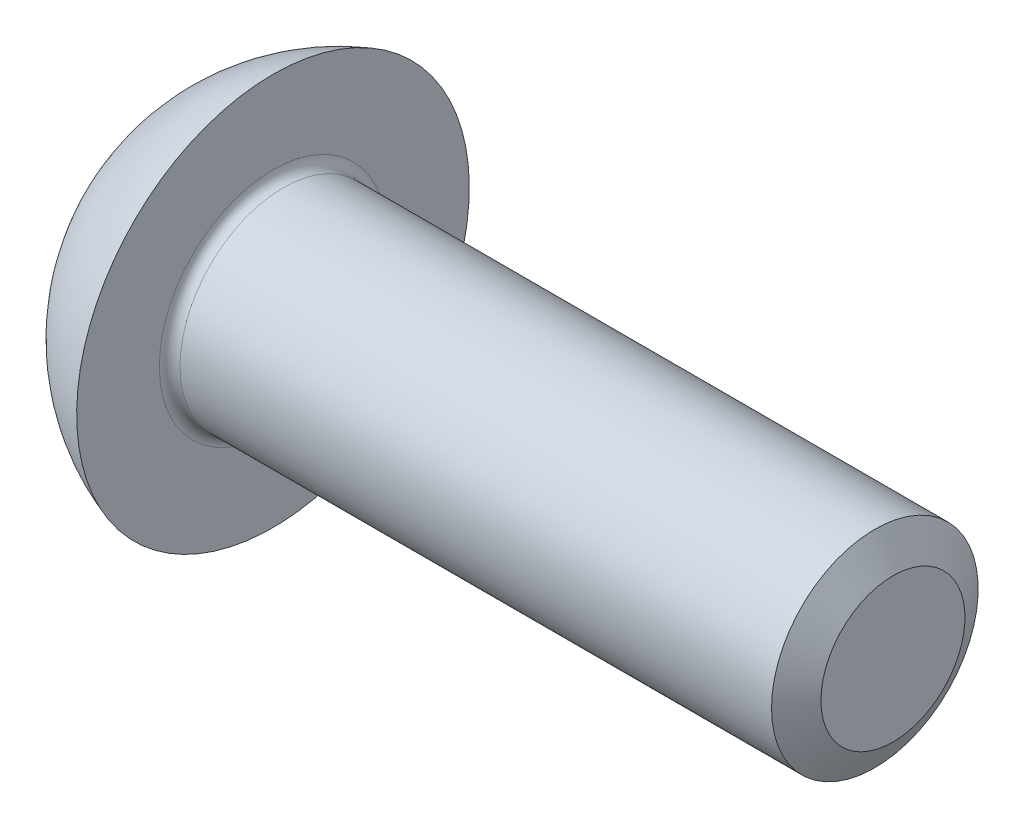
ISO-10303-21;
HEADER;
FILE_DESCRIPTION(('STEP AP214'),'2;1');
FILE_NAME('part.step','',(''),(''),'','','');
FILE_SCHEMA(('AUTOMOTIVE_DESIGN { 1 0 10303 214 1 1 1 1 }'));
ENDSEC;
DATA;
#1=APPLICATION_CONTEXT('core data for automotive mechanical design processes');
#2=APPLICATION_PROTOCOL_DEFINITION('international standard','automotive_design',2000,#1);
#3=PRODUCT_CONTEXT('',#1,'mechanical');
#4=PRODUCT('Part','Part','',(#3));
#5=PRODUCT_RELATED_PRODUCT_CATEGORY('part','',(#4));
#6=PRODUCT_DEFINITION_FORMATION('','',#4);
#7=PRODUCT_DEFINITION_CONTEXT('part definition',#1,'design');
#8=PRODUCT_DEFINITION('design','',#6,#7);
#9=PRODUCT_DEFINITION_SHAPE('','',#8);
#10=(LENGTH_UNIT() NAMED_UNIT(*) SI_UNIT(.MILLI.,.METRE.));
#11=(NAMED_UNIT(*) PLANE_ANGLE_UNIT() SI_UNIT($,.RADIAN.));
#12=(NAMED_UNIT(*) SI_UNIT($,.STERADIAN.) SOLID_ANGLE_UNIT());
#13=UNCERTAINTY_MEASURE_WITH_UNIT(LENGTH_MEASURE(1.E-05),#10,'distance_accuracy_value','');
#14=(GEOMETRIC_REPRESENTATION_CONTEXT(3) GLOBAL_UNCERTAINTY_ASSIGNED_CONTEXT((#13)) GLOBAL_UNIT_ASSIGNED_CONTEXT((#10,
#11,#12)) REPRESENTATION_CONTEXT('',''));
#15=CARTESIAN_POINT('',(0.,0.,0.));
#16=DIRECTION('',(0.,0.,1.));
#17=DIRECTION('',(1.,0.,0.));
#18=AXIS2_PLACEMENT_3D('',#15,#16,#17);
#19=CARTESIAN_POINT('',(-14.2,0.,0.));
#20=DIRECTION('',(-1.,0.,0.));
#21=DIRECTION('',(0.,0.,1.));
#22=AXIS2_PLACEMENT_3D('',#19,#20,#21);
#23=CYLINDRICAL_SURFACE('',#22,2.);
#24=CARTESIAN_POINT('',(-11.8,0.,0.));
#25=DIRECTION('',(-1.,0.,0.));
#26=DIRECTION('',(0.,0.,1.));
#27=AXIS2_PLACEMENT_3D('',#24,#25,#26);
#28=CIRCLE('',#27,2.);
#29=CARTESIAN_POINT('',(-11.8,0.,2.));
#30=VERTEX_POINT('',#29);
#31=EDGE_CURVE('E261',#30,#30,#28,.T.);
#32=ORIENTED_EDGE('',*,*,#31,.F.);
#33=EDGE_LOOP('',(#32));
#34=FACE_BOUND('',#33,.T.);
#35=CARTESIAN_POINT('',(-0.35,0.,0.));
#36=DIRECTION('',(-1.,0.,0.));
#37=DIRECTION('',(0.,0.,1.));
#38=AXIS2_PLACEMENT_3D('',#35,#36,#37);
#39=CIRCLE('',#38,2.);
#40=CARTESIAN_POINT('',(-0.35,0.,2.));
#41=VERTEX_POINT('',#40);
#42=EDGE_CURVE('E406',#41,#41,#39,.T.);
#43=ORIENTED_EDGE('',*,*,#42,.T.);
#44=EDGE_LOOP('',(#43));
#45=FACE_BOUND('',#44,.T.);
#46=ADVANCED_FACE('F40',(#34,#45),#23,.T.);
#47=CARTESIAN_POINT('',(-14.2,0.,0.));
#48=DIRECTION('',(1.,0.,0.));
#49=DIRECTION('',(0.,0.,-1.));
#50=AXIS2_PLACEMENT_3D('',#47,#48,#49);
#51=PLANE('',#50);
#52=CARTESIAN_POINT('',(-14.2,0.,0.));
#53=DIRECTION('',(-1.,0.,0.));
#54=DIRECTION('',(0.,0.,1.));
#55=AXIS2_PLACEMENT_3D('',#52,#53,#54);
#56=CIRCLE('',#55,2.);
#57=CARTESIAN_POINT('',(-14.2,2.,0.));
#58=VERTEX_POINT('',#57);
#59=EDGE_CURVE('E253',#58,#58,#56,.T.);
#60=ORIENTED_EDGE('',*,*,#59,.T.);
#61=EDGE_LOOP('',(#60));
#62=FACE_BOUND('',#61,.T.);
#63=CARTESIAN_POINT('',(-14.2,0.,0.));
#64=DIRECTION('',(1.,0.,0.));
#65=DIRECTION('',(0.,0.,-1.));
#66=AXIS2_PLACEMENT_3D('',#63,#64,#65);
#67=CIRCLE('',#66,1.44337567297406);
#68=CARTESIAN_POINT('',(-14.2,-0.721687836487032,-1.25));
#69=VERTEX_POINT('',#68);
#70=CARTESIAN_POINT('',(-14.2,-1.44337567297406,0.));
#71=VERTEX_POINT('',#70);
#72=EDGE_CURVE('E11',#69,#71,#67,.F.);
#73=ORIENTED_EDGE('',*,*,#72,.F.);
#74=CARTESIAN_POINT('',(-14.2,0.721687836487032,-1.25));
#75=VERTEX_POINT('',#74);
#76=EDGE_CURVE('E44',#75,#69,#67,.F.);
#77=ORIENTED_EDGE('',*,*,#76,.F.);
#78=CARTESIAN_POINT('',(-14.2,1.44337567297406,0.));
#79=VERTEX_POINT('',#78);
#80=EDGE_CURVE('E113',#79,#75,#67,.F.);
#81=ORIENTED_EDGE('',*,*,#80,.F.);
#82=CARTESIAN_POINT('',(-14.2,0.721687836487032,1.25));
#83=VERTEX_POINT('',#82);
#84=EDGE_CURVE('E326',#83,#79,#67,.F.);
#85=ORIENTED_EDGE('',*,*,#84,.F.);
#86=CARTESIAN_POINT('',(-14.2,-0.721687836487031,1.25));
#87=VERTEX_POINT('',#86);
#88=EDGE_CURVE('E49',#87,#83,#67,.F.);
#89=ORIENTED_EDGE('',*,*,#88,.F.);
#90=CARTESIAN_POINT('',(-14.2,0.,0.));
#91=DIRECTION('',(-1.,0.,0.));
#92=DIRECTION('',(0.,-1.,0.));
#93=AXIS2_PLACEMENT_3D('',#90,#91,#92);
#94=CIRCLE('',#93,1.44337567297406);
#95=EDGE_CURVE('E116',#71,#87,#94,.T.);
#96=ORIENTED_EDGE('',*,*,#95,.F.);
#97=EDGE_LOOP('',(#73,#77,#81,#85,#89,#96));
#98=FACE_BOUND('',#97,.T.);
#99=ADVANCED_FACE('F42',(#62,#98),#51,.F.);
#100=CARTESIAN_POINT('',(-10.7272727272727,0.,0.));
#101=DIRECTION('',(-1.,0.,0.));
#102=DIRECTION('',(0.,1.,0.));
#103=AXIS2_PLACEMENT_3D('',#100,#101,#102);
#104=SPHERICAL_SURFACE('',#103,4.00747235932374);
#105=CARTESIAN_POINT('',(-12.,0.,0.));
#106=DIRECTION('',(-1.,0.,0.));
#107=DIRECTION('',(0.,0.,1.));
#108=AXIS2_PLACEMENT_3D('',#105,#106,#107);
#109=CIRCLE('',#108,3.8);
#110=CARTESIAN_POINT('',(-12.,3.8,0.));
#111=VERTEX_POINT('',#110);
#112=EDGE_CURVE('E256',#111,#111,#109,.T.);
#113=CARTESIAN_POINT('',(-14.2,2.,0.));
#114=CARTESIAN_POINT('',(-14.1848940441993,2.0262295590073,0.));
#115=CARTESIAN_POINT('',(-14.1694908144314,2.05228791024858,0.));
#116=CARTESIAN_POINT('',(-14.1380979525594,2.10404896261472,0.));
#117=CARTESIAN_POINT('',(-14.1221083204554,2.12975166373959,0.));
#118=CARTESIAN_POINT('',(-14.0895507995097,2.18078818128854,0.));
#119=CARTESIAN_POINT('',(-14.072982910668,2.20612199771262,0.));
#120=CARTESIAN_POINT('',(-14.0392773993975,2.25640774959029,0.));
#121=CARTESIAN_POINT('',(-14.0221397769687,2.28135968504386,0.));
#122=CARTESIAN_POINT('',(-13.9873035925655,2.33086886166223,0.));
#123=CARTESIAN_POINT('',(-13.9696050305911,2.35542610282703,0.));
#124=CARTESIAN_POINT('',(-13.9336560549214,2.40413328370188,0.));
#125=CARTESIAN_POINT('',(-13.9154056412261,2.42828322341193,0.));
#126=CARTESIAN_POINT('',(-13.8783623317131,2.47616340238235,0.));
#127=CARTESIAN_POINT('',(-13.8595694358953,2.49989364164271,0.));
#128=CARTESIAN_POINT('',(-13.8214508106667,2.54692223644896,0.));
#129=CARTESIAN_POINT('',(-13.8021250812559,2.57022059199485,0.));
#130=CARTESIAN_POINT('',(-13.7629507108208,2.61637345777279,0.));
#131=CARTESIAN_POINT('',(-13.7431020697966,2.63922796800484,0.));
#132=CARTESIAN_POINT('',(-13.7028920666117,2.68448140944799,0.));
#133=CARTESIAN_POINT('',(-13.682530704451,2.70688034065911,0.));
#134=CARTESIAN_POINT('',(-13.6413057126977,2.75121112424681,0.));
#135=CARTESIAN_POINT('',(-13.6204420831052,2.77314297662341,0.));
#136=CARTESIAN_POINT('',(-13.5782232680636,2.81652834253228,0.));
#137=CARTESIAN_POINT('',(-13.5568680826145,2.83798185606455,0.));
#138=CARTESIAN_POINT('',(-13.5136771198039,2.88039952985806,0.));
#139=CARTESIAN_POINT('',(-13.4918413424423,2.90136369011931,0.));
#140=CARTESIAN_POINT('',(-13.447700406491,2.94279189418253,0.));
#141=CARTESIAN_POINT('',(-13.4253952479013,2.96325593798452,0.));
#142=CARTESIAN_POINT('',(-13.3803270011625,3.00367340270524,0.));
#143=CARTESIAN_POINT('',(-13.3575639130134,3.02362682362399,0.));
#144=CARTESIAN_POINT('',(-13.3115914939299,3.06301279831263,0.));
#145=CARTESIAN_POINT('',(-13.2883821629955,3.08244535208254,0.));
#146=CARTESIAN_POINT('',(-13.2415291742204,3.12077961562579,0.));
#147=CARTESIAN_POINT('',(-13.2178855163797,3.13968132539914,0.));
#148=CARTESIAN_POINT('',(-13.1701760126585,3.17694419664163,0.));
#149=CARTESIAN_POINT('',(-13.1461101667779,3.19530535811077,0.));
#150=CARTESIAN_POINT('',(-13.0975686425984,3.23147770595957,0.));
#151=CARTESIAN_POINT('',(-13.0730929642995,3.24928889233922,0.));
#152=CARTESIAN_POINT('',(-13.0237443413165,3.2843521455859,0.));
#153=CARTESIAN_POINT('',(-12.9988713966324,3.30160421245294,0.));
#154=CARTESIAN_POINT('',(-12.9487410108723,3.3355403693082,0.));
#155=CARTESIAN_POINT('',(-12.9234835697963,3.35222445929642,0.));
#156=CARTESIAN_POINT('',(-12.8725971586496,3.38501609663248,0.));
#157=CARTESIAN_POINT('',(-12.846968188579,3.40112364398032,0.));
#158=CARTESIAN_POINT('',(-12.7953518775865,3.43275392627554,0.));
#159=CARTESIAN_POINT('',(-12.7693645366645,3.44827666122294,0.));
#160=CARTESIAN_POINT('',(-12.7170448261044,3.47872934920754,0.));
#161=CARTESIAN_POINT('',(-12.6907124564662,3.49365930224475,0.));
#162=CARTESIAN_POINT('',(-12.6377162077463,3.52291876123,0.));
#163=CARTESIAN_POINT('',(-12.6110523286645,3.53724826717803,0.));
#164=CARTESIAN_POINT('',(-12.5574067505418,3.56529947511373,0.));
#165=CARTESIAN_POINT('',(-12.5304250515009,3.57902117710138,0.));
#166=CARTESIAN_POINT('',(-12.4761576860719,3.60584973217452,0.));
#167=CARTESIAN_POINT('',(-12.4488720196837,3.61895658526,0.));
#168=CARTESIAN_POINT('',(-12.3940107283966,3.6445487137135,0.));
#169=CARTESIAN_POINT('',(-12.3664351034975,3.65703398908152,0.));
#170=CARTESIAN_POINT('',(-12.3110080522769,3.6813765507008,0.));
#171=CARTESIAN_POINT('',(-12.2831566259553,3.69323383695206,0.));
#172=CARTESIAN_POINT('',(-12.2271922728732,3.71631433772655,0.));
#173=CARTESIAN_POINT('',(-12.1990793461126,3.72753755224977,0.));
#174=CARTESIAN_POINT('',(-12.1426064188229,3.74934412871163,0.));
#175=CARTESIAN_POINT('',(-12.1142464182938,3.75992749065027,0.));
#176=CARTESIAN_POINT('',(-12.0572939289701,3.78044899835327,0.));
#177=CARTESIAN_POINT('',(-12.0287014401756,3.79038714411763,0.));
#178=CARTESIAN_POINT('',(-12.,3.8,0.));
#179=B_SPLINE_CURVE_WITH_KNOTS('',3,(#113,#114,#115,#116,#117,#118,#119,#120,#121,#122,#123,
#124,#125,#126,#127,#128,#129,#130,#131,#132,#133,#134,#135,#136,#137,#138,#139,#140,#141,#142,
#143,#144,#145,#146,#147,#148,#149,#150,#151,#152,#153,#154,#155,#156,#157,#158,#159,#160,#161,
#162,#163,#164,#165,#166,#167,#168,#169,#170,#171,#172,#173,#174,#175,#176,#177,#178),
.UNSPECIFIED.,.F.,.F.,(4,2,2,2,2,2,2,2,2,2,2,2,2,2,2,2,2,2,2,2,2,2,2,2,2,2,2,2,2,2,2,2,4),(0.,
0.0908034330338798,0.181606866067759,0.272410299101638,0.363213732135518,0.454017165169397,
0.544820598203276,0.635624031237156,0.726427464271036,0.817230897304915,0.908034330338795,
0.998837763372673,1.08964119640655,1.18044462944043,1.27124806247431,1.36205149550819,
1.45285492854207,1.54365836157595,1.63446179460983,1.72526522764371,1.81606866067759,
1.90687209371147,1.99767552674535,2.08847895977923,2.17928239281311,2.27008582584699,
2.36088925888087,2.45169269191474,2.54249612494862,2.6332995579825,2.72410299101638,
2.81490642405026,2.90570985708414),.UNSPECIFIED.);
#180=EDGE_CURVE('BSEAM242',#58,#111,#179,.T.);
#181=ORIENTED_EDGE('',*,*,#59,.F.);
#182=ORIENTED_EDGE('',*,*,#112,.T.);
#183=ORIENTED_EDGE('',*,*,#180,.T.);
#184=ORIENTED_EDGE('',*,*,#180,.F.);
#185=EDGE_LOOP('',(#181,#183,#182,#184));
#186=FACE_BOUND('',#185,.T.);
#187=ADVANCED_FACE('F242',(#186),#104,.T.);
#188=CARTESIAN_POINT('',(-12.,2.2,0.));
#189=DIRECTION('',(-1.,0.,0.));
#190=DIRECTION('',(0.,0.,1.));
#191=AXIS2_PLACEMENT_3D('',#188,#189,#190);
#192=PLANE('',#191);
#193=ORIENTED_EDGE('',*,*,#112,.F.);
#194=EDGE_LOOP('',(#193));
#195=FACE_BOUND('',#194,.T.);
#196=CARTESIAN_POINT('',(-12.,0.,0.));
#197=DIRECTION('',(-1.,0.,0.));
#198=DIRECTION('',(0.,0.,1.));
#199=AXIS2_PLACEMENT_3D('',#196,#197,#198);
#200=CIRCLE('',#199,2.2);
#201=CARTESIAN_POINT('',(-12.,0.,2.2));
#202=VERTEX_POINT('',#201);
#203=EDGE_CURVE('E257',#202,#202,#200,.T.);
#204=ORIENTED_EDGE('',*,*,#203,.T.);
#205=EDGE_LOOP('',(#204));
#206=FACE_BOUND('',#205,.T.);
#207=ADVANCED_FACE('F239',(#195,#206),#192,.F.);
#208=CARTESIAN_POINT('',(-11.8,0.,0.));
#209=DIRECTION('',(-1.,0.,0.));
#210=DIRECTION('',(0.,0.,1.));
#211=AXIS2_PLACEMENT_3D('',#208,#209,#210);
#212=TOROIDAL_SURFACE('',#211,2.2,0.200000000000001);
#213=ORIENTED_EDGE('',*,*,#203,.F.);
#214=EDGE_LOOP('',(#213));
#215=FACE_BOUND('',#214,.T.);
#216=ORIENTED_EDGE('',*,*,#31,.T.);
#217=EDGE_LOOP('',(#216));
#218=FACE_BOUND('',#217,.T.);
#219=ADVANCED_FACE('F236',(#215,#218),#212,.F.);
#220=CARTESIAN_POINT('',(-13.83,0.,0.));
#221=DIRECTION('',(-1.,0.,0.));
#222=DIRECTION('',(0.,-1.,0.));
#223=AXIS2_PLACEMENT_3D('',#220,#221,#222);
#224=CONICAL_SURFACE('',#223,0.,1.31985626102756);
#225=CARTESIAN_POINT('',(-14.4099346759325,-1.885644561076,-1.25));
#226=CARTESIAN_POINT('',(-14.3978717207476,-1.82917708741649,-1.25));
#227=CARTESIAN_POINT('',(-14.3859628503841,-1.7726766725723,-1.25));
#228=CARTESIAN_POINT('',(-14.3625309817374,-1.65959353753871,-1.25));
#229=CARTESIAN_POINT('',(-14.3510079994509,-1.60301081403847,-1.25));
#230=CARTESIAN_POINT('',(-14.3171150455956,-1.43301680255399,-1.25));
#231=CARTESIAN_POINT('',(-14.2954436732229,-1.31946408423816,-1.25));
#232=CARTESIAN_POINT('',(-14.2550957638519,-1.09274070822473,-1.25));
#233=CARTESIAN_POINT('',(-14.2363969731627,-0.97957409090879,-1.25));
#234=CARTESIAN_POINT('',(-14.2032623365578,-0.752620098767596,-1.25));
#235=CARTESIAN_POINT('',(-14.188825705465,-0.638832842215425,-1.25));
#236=CARTESIAN_POINT('',(-14.1660896767959,-0.409425109570646,-1.25));
#237=CARTESIAN_POINT('',(-14.1578544497063,-0.293797778292055,-1.25));
#238=CARTESIAN_POINT('',(-14.1515679025376,-0.12016451287169,-1.25));
#239=CARTESIAN_POINT('',(-14.150483164521,-0.062262792869709,-1.25));
#240=CARTESIAN_POINT('',(-14.1503795328621,0.05354256436343,-1.25));
#241=CARTESIAN_POINT('',(-14.1513606413601,0.111446201596512,-1.25));
#242=CARTESIAN_POINT('',(-14.1573598650309,0.28547429561123,-1.25));
#243=CARTESIAN_POINT('',(-14.1654487463646,0.401498867331898,-1.25));
#244=CARTESIAN_POINT('',(-14.1881044285101,0.632939913567424,-1.25));
#245=CARTESIAN_POINT('',(-14.2026754362751,0.748355943831217,-1.25));
#246=CARTESIAN_POINT('',(-14.2365518645336,0.980878548339568,-1.25));
#247=CARTESIAN_POINT('',(-14.2559479393881,1.09797147869704,-1.25));
#248=CARTESIAN_POINT('',(-14.297694705209,1.33163516353436,-1.25));
#249=CARTESIAN_POINT('',(-14.3200458280349,1.44820583911092,-1.25));
#250=CARTESIAN_POINT('',(-14.3666691464558,1.68099121637416,-1.25));
#251=CARTESIAN_POINT('',(-14.3909418646374,1.79720581223611,-1.25));
#252=CARTESIAN_POINT('',(-14.4407644332086,2.02936144854685,-1.25));
#253=CARTESIAN_POINT('',(-14.4663143094331,2.14530248341221,-1.25));
#254=CARTESIAN_POINT('',(-14.518006571917,2.37571314631909,-1.25));
#255=CARTESIAN_POINT('',(-14.5441393559518,2.49018493743663,-1.25));
#256=CARTESIAN_POINT('',(-14.5970181249123,2.71898894131966,-1.25));
#257=CARTESIAN_POINT('',(-14.6237641225282,2.8333211511449,-1.25));
#258=CARTESIAN_POINT('',(-14.6776683130688,3.06173187864781,-1.25));
#259=CARTESIAN_POINT('',(-14.7048259274931,3.17581053313172,-1.25));
#260=CARTESIAN_POINT('',(-14.7594820608418,3.40388218743046,-1.25));
#261=CARTESIAN_POINT('',(-14.7869805683896,3.51787518996983,-1.25));
#262=CARTESIAN_POINT('',(-14.8145979060137,3.63183906574753,-1.25));
#263=B_SPLINE_CURVE_WITH_KNOTS('',3,(#225,#226,#227,#228,#229,#230,#231,#232,#233,#234,#235,
#236,#237,#238,#239,#240,#241,#242,#243,#244,#245,#246,#247,#248,#249,#250,#251,#252,#253,#254,
#255,#256,#257,#258,#259,#260,#261,#262),.UNSPECIFIED.,.F.,.F.,(4,2,2,2,2,2,2,2,2,2,2,2,2,2,2,2,
2,2,4),(0.,0.173224298995285,0.346455770019722,0.693239171189212,1.03728991141696,
1.38127723083866,1.72877689604067,1.90247833739644,2.07617995870963,2.42483219738436,
2.77371104508349,3.12971850144866,3.48577804345035,3.84193475233927,4.19809866864178,
4.55034691705482,4.90260246171338,5.25440194240088,5.60618971383707),.UNSPECIFIED.);
#264=EDGE_CURVE('E104',#69,#75,#263,.T.);
#265=ORIENTED_EDGE('',*,*,#264,.T.);
#266=ORIENTED_EDGE('',*,*,#76,.T.);
#267=EDGE_LOOP('',(#265,#266));
#268=FACE_BOUND('',#267,.T.);
#269=ADVANCED_FACE('F108',(#268),#224,.F.);
#270=CARTESIAN_POINT('',(-14.2000296035517,0.721572366433194,-1.2502));
#271=CARTESIAN_POINT('',(-14.1923376245114,0.751560236122211,-1.19825948608787));
#272=CARTESIAN_POINT('',(-14.1853558988612,0.781597955311093,-1.14623263030924));
#273=CARTESIAN_POINT('',(-14.1730912390252,0.841770545746215,-1.04201064645257));
#274=CARTESIAN_POINT('',(-14.1678089341386,0.871905448817342,-0.989815463252219));
#275=CARTESIAN_POINT('',(-14.1592477971586,0.932104975245319,-0.885546824887377));
#276=CARTESIAN_POINT('',(-14.1559596086559,0.96216925702196,-0.833473961357168));
#277=CARTESIAN_POINT('',(-14.1515506008694,1.0223329488635,-0.729267390316703));
#278=CARTESIAN_POINT('',(-14.1504293994002,1.05243235179702,-0.677133695158352));
#279=CARTESIAN_POINT('',(-14.1504293994002,1.11263115766407,-0.572866304841649));
#280=CARTESIAN_POINT('',(-14.1515506008694,1.1427305605976,-0.520732609683297));
#281=CARTESIAN_POINT('',(-14.1559596086559,1.20289425243914,-0.416526038642832));
#282=CARTESIAN_POINT('',(-14.1592477971586,1.23295853421578,-0.364453175112624));
#283=CARTESIAN_POINT('',(-14.1678089341386,1.29315806064375,-0.260184536747781));
#284=CARTESIAN_POINT('',(-14.1730912390252,1.32329296371488,-0.207989353547427));
#285=CARTESIAN_POINT('',(-14.1853558988612,1.38346555415,-0.103767369690763));
#286=CARTESIAN_POINT('',(-14.1923376245114,1.41350327333889,-0.0517405139121317));
#287=CARTESIAN_POINT('',(-14.2000296035517,1.4434911430279,0.000199999999999756));
#288=B_SPLINE_CURVE_WITH_KNOTS('',3,(#270,#271,#272,#273,#274,#275,#276,#277,#278,#279,#280,
#281,#282,#283,#284,#285,#286,#287),.UNSPECIFIED.,.F.,.F.,(4,2,2,2,2,2,2,2,4),(0.,
0.181409592460798,0.362886284169927,0.543504761741732,0.724091381228726,0.904678000715721,
1.08529647828753,1.26677316999665,1.44818276245745),.UNSPECIFIED.);
#289=EDGE_CURVE('E132',#75,#79,#288,.T.);
#290=ORIENTED_EDGE('',*,*,#289,.T.);
#291=ORIENTED_EDGE('',*,*,#80,.T.);
#292=EDGE_LOOP('',(#290,#291));
#293=FACE_BOUND('',#292,.T.);
#294=ADVANCED_FACE('F160',(#293),#224,.F.);
#295=CARTESIAN_POINT('',(-14.2000296035517,1.4434911430279,-0.000200000000000031));
#296=CARTESIAN_POINT('',(-14.1923376245114,1.41350327333889,0.0517405139121313));
#297=CARTESIAN_POINT('',(-14.1853558988612,1.38346555415,0.103767369690762));
#298=CARTESIAN_POINT('',(-14.1730912390252,1.32329296371488,0.207989353547427));
#299=CARTESIAN_POINT('',(-14.1678089341386,1.29315806064375,0.260184536747781));
#300=CARTESIAN_POINT('',(-14.1592477971586,1.23295853421578,0.364453175112623));
#301=CARTESIAN_POINT('',(-14.1559596086559,1.20289425243914,0.416526038642832));
#302=CARTESIAN_POINT('',(-14.1515506008694,1.1427305605976,0.520732609683297));
#303=CARTESIAN_POINT('',(-14.1504293994002,1.11263115766407,0.572866304841648));
#304=CARTESIAN_POINT('',(-14.1504293994002,1.05243235179702,0.677133695158351));
#305=CARTESIAN_POINT('',(-14.1515506008694,1.0223329488635,0.729267390316703));
#306=CARTESIAN_POINT('',(-14.1559596086559,0.96216925702196,0.833473961357168));
#307=CARTESIAN_POINT('',(-14.1592477971586,0.93210497524532,0.885546824887376));
#308=CARTESIAN_POINT('',(-14.1678089341386,0.871905448817342,0.989815463252218));
#309=CARTESIAN_POINT('',(-14.1730912390252,0.841770545746216,1.04201064645257));
#310=CARTESIAN_POINT('',(-14.1853558988612,0.781597955311094,1.14623263030924));
#311=CARTESIAN_POINT('',(-14.1923376245114,0.751560236122211,1.19825948608787));
#312=CARTESIAN_POINT('',(-14.2000296035517,0.721572366433195,1.2502));
#313=B_SPLINE_CURVE_WITH_KNOTS('',3,(#295,#296,#297,#298,#299,#300,#301,#302,#303,#304,#305,
#306,#307,#308,#309,#310,#311,#312),.UNSPECIFIED.,.F.,.F.,(4,2,2,2,2,2,2,2,4),(0.,
0.181409592460797,0.362886284169927,0.543504761741732,0.724091381228726,0.904678000715721,
1.08529647828753,1.26677316999665,1.44818276245745),.UNSPECIFIED.);
#314=EDGE_CURVE('E182',#79,#83,#313,.T.);
#315=ORIENTED_EDGE('',*,*,#314,.T.);
#316=ORIENTED_EDGE('',*,*,#84,.T.);
#317=EDGE_LOOP('',(#315,#316));
#318=FACE_BOUND('',#317,.T.);
#319=ADVANCED_FACE('F154',(#318),#224,.F.);
#320=CARTESIAN_POINT('',(-14.4099346759325,-1.885644561076,1.25));
#321=CARTESIAN_POINT('',(-14.3978717207476,-1.8291770874165,1.25));
#322=CARTESIAN_POINT('',(-14.3859628503841,-1.7726766725723,1.25));
#323=CARTESIAN_POINT('',(-14.3625309817374,-1.65959353753871,1.25));
#324=CARTESIAN_POINT('',(-14.3510079994509,-1.60301081403847,1.25));
#325=CARTESIAN_POINT('',(-14.3171150455956,-1.43301680255399,1.25));
#326=CARTESIAN_POINT('',(-14.2954436732229,-1.31946408423816,1.25));
#327=CARTESIAN_POINT('',(-14.2550957638519,-1.09274070822473,1.25));
#328=CARTESIAN_POINT('',(-14.2363969731627,-0.97957409090879,1.25));
#329=CARTESIAN_POINT('',(-14.2032623365578,-0.752620098767597,1.25));
#330=CARTESIAN_POINT('',(-14.188825705465,-0.638832842215426,1.25));
#331=CARTESIAN_POINT('',(-14.1660896767959,-0.409425109570646,1.25));
#332=CARTESIAN_POINT('',(-14.1578544497063,-0.293797778292056,1.25));
#333=CARTESIAN_POINT('',(-14.1515679025376,-0.120164512871691,1.25));
#334=CARTESIAN_POINT('',(-14.150483164521,-0.0622627928697095,1.25));
#335=CARTESIAN_POINT('',(-14.1503795328621,0.0535425643634295,1.25));
#336=CARTESIAN_POINT('',(-14.1513606413601,0.111446201596512,1.25));
#337=CARTESIAN_POINT('',(-14.1573598650309,0.285474295611229,1.25));
#338=CARTESIAN_POINT('',(-14.1654487463646,0.401498867331897,1.25));
#339=CARTESIAN_POINT('',(-14.1881044285101,0.632939913567424,1.25));
#340=CARTESIAN_POINT('',(-14.2026754362751,0.748355943831216,1.25));
#341=CARTESIAN_POINT('',(-14.2365518645336,0.980878548339567,1.25));
#342=CARTESIAN_POINT('',(-14.2559479393881,1.09797147869704,1.25));
#343=CARTESIAN_POINT('',(-14.297694705209,1.33163516353436,1.25));
#344=CARTESIAN_POINT('',(-14.3200458280349,1.44820583911092,1.25));
#345=CARTESIAN_POINT('',(-14.3666691464558,1.68099121637416,1.25));
#346=CARTESIAN_POINT('',(-14.3909418646374,1.79720581223611,1.25));
#347=CARTESIAN_POINT('',(-14.4407644332086,2.02936144854685,1.25));
#348=CARTESIAN_POINT('',(-14.4663143094331,2.14530248341221,1.25));
#349=CARTESIAN_POINT('',(-14.518006571917,2.37571314631909,1.25));
#350=CARTESIAN_POINT('',(-14.5441393559518,2.49018493743663,1.25));
#351=CARTESIAN_POINT('',(-14.5970181249123,2.71898894131966,1.25));
#352=CARTESIAN_POINT('',(-14.6237641225282,2.8333211511449,1.25));
#353=CARTESIAN_POINT('',(-14.6776683130688,3.06173187864781,1.25));
#354=CARTESIAN_POINT('',(-14.7048259274931,3.17581053313172,1.25));
#355=CARTESIAN_POINT('',(-14.7594820608418,3.40388218743046,1.25));
#356=CARTESIAN_POINT('',(-14.7869805683896,3.51787518996983,1.25));
#357=CARTESIAN_POINT('',(-14.8145979060137,3.63183906574753,1.25));
#358=B_SPLINE_CURVE_WITH_KNOTS('',3,(#320,#321,#322,#323,#324,#325,#326,#327,#328,#329,#330,
#331,#332,#333,#334,#335,#336,#337,#338,#339,#340,#341,#342,#343,#344,#345,#346,#347,#348,#349,
#350,#351,#352,#353,#354,#355,#356,#357),.UNSPECIFIED.,.F.,.F.,(4,2,2,2,2,2,2,2,2,2,2,2,2,2,2,2,
2,2,4),(0.,0.173224298995285,0.346455770019722,0.693239171189212,1.03728991141696,
1.38127723083866,1.72877689604067,1.90247833739644,2.07617995870963,2.42483219738436,
2.77371104508349,3.12971850144865,3.48577804345035,3.84193475233927,4.19809866864178,
4.55034691705482,4.90260246171338,5.25440194240088,5.60618971383707),.UNSPECIFIED.);
#359=EDGE_CURVE('E61',#83,#87,#358,.F.);
#360=ORIENTED_EDGE('',*,*,#359,.T.);
#361=ORIENTED_EDGE('',*,*,#88,.T.);
#362=EDGE_LOOP('',(#360,#361));
#363=FACE_BOUND('',#362,.T.);
#364=ADVANCED_FACE('F159',(#363),#224,.F.);
#365=CARTESIAN_POINT('',(-14.2000296035517,-0.721572366433195,1.2502));
#366=CARTESIAN_POINT('',(-14.1923376245114,-0.751560236122212,1.19825948608787));
#367=CARTESIAN_POINT('',(-14.1853558988612,-0.781597955311094,1.14623263030924));
#368=CARTESIAN_POINT('',(-14.1730912390252,-0.841770545746216,1.04201064645257));
#369=CARTESIAN_POINT('',(-14.1678089341386,-0.871905448817343,0.989815463252219));
#370=CARTESIAN_POINT('',(-14.1592477971586,-0.93210497524532,0.885546824887376));
#371=CARTESIAN_POINT('',(-14.1559596086559,-0.962169257021961,0.833473961357168));
#372=CARTESIAN_POINT('',(-14.1515506008694,-1.0223329488635,0.729267390316703));
#373=CARTESIAN_POINT('',(-14.1504293994002,-1.05243235179702,0.677133695158351));
#374=CARTESIAN_POINT('',(-14.1504293994002,-1.11263115766407,0.572866304841648));
#375=CARTESIAN_POINT('',(-14.1515506008694,-1.1427305605976,0.520732609683297));
#376=CARTESIAN_POINT('',(-14.1559596086559,-1.20289425243914,0.416526038642832));
#377=CARTESIAN_POINT('',(-14.1592477971586,-1.23295853421578,0.364453175112623));
#378=CARTESIAN_POINT('',(-14.1678089341386,-1.29315806064376,0.260184536747781));
#379=CARTESIAN_POINT('',(-14.1730912390252,-1.32329296371488,0.207989353547427));
#380=CARTESIAN_POINT('',(-14.1853558988612,-1.38346555415,0.103767369690762));
#381=CARTESIAN_POINT('',(-14.1923376245114,-1.41350327333889,0.0517405139121311));
#382=CARTESIAN_POINT('',(-14.2000296035517,-1.4434911430279,-0.000200000000000191));
#383=B_SPLINE_CURVE_WITH_KNOTS('',3,(#365,#366,#367,#368,#369,#370,#371,#372,#373,#374,#375,
#376,#377,#378,#379,#380,#381,#382),.UNSPECIFIED.,.F.,.F.,(4,2,2,2,2,2,2,2,4),(0.,
0.181409592460797,0.362886284169927,0.543504761741732,0.724091381228726,0.904678000715721,
1.08529647828753,1.26677316999666,1.44818276245745),.UNSPECIFIED.);
#384=EDGE_CURVE('E55',#87,#71,#383,.T.);
#385=ORIENTED_EDGE('',*,*,#384,.T.);
#386=ORIENTED_EDGE('',*,*,#95,.T.);
#387=EDGE_LOOP('',(#385,#386));
#388=FACE_BOUND('',#387,.T.);
#389=ADVANCED_FACE('F313',(#388),#224,.F.);
#390=CARTESIAN_POINT('',(-14.2000296035517,-1.4434911430279,0.000199999999999413));
#391=CARTESIAN_POINT('',(-14.1923376245114,-1.41350327333889,-0.0517405139121318));
#392=CARTESIAN_POINT('',(-14.1853558988612,-1.38346555415,-0.103767369690763));
#393=CARTESIAN_POINT('',(-14.1730912390252,-1.32329296371488,-0.207989353547427));
#394=CARTESIAN_POINT('',(-14.1678089341386,-1.29315806064376,-0.260184536747781));
#395=CARTESIAN_POINT('',(-14.1592477971586,-1.23295853421578,-0.364453175112624));
#396=CARTESIAN_POINT('',(-14.1559596086559,-1.20289425243914,-0.416526038642832));
#397=CARTESIAN_POINT('',(-14.1515506008694,-1.1427305605976,-0.520732609683297));
#398=CARTESIAN_POINT('',(-14.1504293994002,-1.11263115766407,-0.572866304841649));
#399=CARTESIAN_POINT('',(-14.1504293994002,-1.05243235179702,-0.677133695158352));
#400=CARTESIAN_POINT('',(-14.1515506008694,-1.0223329488635,-0.729267390316703));
#401=CARTESIAN_POINT('',(-14.1559596086559,-0.96216925702196,-0.833473961357168));
#402=CARTESIAN_POINT('',(-14.1592477971586,-0.93210497524532,-0.885546824887376));
#403=CARTESIAN_POINT('',(-14.1678089341386,-0.871905448817343,-0.989815463252219));
#404=CARTESIAN_POINT('',(-14.1730912390252,-0.841770545746216,-1.04201064645257));
#405=CARTESIAN_POINT('',(-14.1853558988612,-0.781597955311094,-1.14623263030924));
#406=CARTESIAN_POINT('',(-14.1923376245114,-0.751560236122212,-1.19825948608787));
#407=CARTESIAN_POINT('',(-14.2000296035517,-0.721572366433195,-1.2502));
#408=B_SPLINE_CURVE_WITH_KNOTS('',3,(#390,#391,#392,#393,#394,#395,#396,#397,#398,#399,#400,
#401,#402,#403,#404,#405,#406,#407),.UNSPECIFIED.,.F.,.F.,(4,2,2,2,2,2,2,2,4),(0.,
0.181409592460798,0.362886284169926,0.543504761741732,0.724091381228726,0.904678000715721,
1.08529647828753,1.26677316999665,1.44818276245745),.UNSPECIFIED.);
#409=EDGE_CURVE('E96',#71,#69,#408,.T.);
#410=ORIENTED_EDGE('',*,*,#409,.T.);
#411=ORIENTED_EDGE('',*,*,#72,.T.);
#412=EDGE_LOOP('',(#410,#411));
#413=FACE_BOUND('',#412,.T.);
#414=ADVANCED_FACE('F98',(#413),#224,.F.);
#415=CARTESIAN_POINT('',(-12.9,0.,0.));
#416=DIRECTION('',(-1.,0.,0.));
#417=DIRECTION('',(0.,0.,1.));
#418=AXIS2_PLACEMENT_3D('',#415,#416,#417);
#419=CONICAL_SURFACE('',#418,1.44337567297406,1.01324881882863);
#420=CARTESIAN_POINT('',(-12.,0.,0.));
#421=VERTEX_POINT('',#420);
#422=VERTEX_LOOP('',#421);
#423=FACE_BOUND('',#422,.T.);
#424=CARTESIAN_POINT('',(-13.3527945795421,-1.77325319370586,1.25));
#425=CARTESIAN_POINT('',(-13.3272313608337,-1.72308054748253,1.25));
#426=CARTESIAN_POINT('',(-13.3019425610441,-1.67276579739611,1.25));
#427=CARTESIAN_POINT('',(-13.2520602884769,-1.57178113050656,1.25));
#428=CARTESIAN_POINT('',(-13.2274669508561,-1.52111114702254,1.25));
#429=CARTESIAN_POINT('',(-13.1789832389279,-1.41905106562434,1.25));
#430=CARTESIAN_POINT('',(-13.1550981267071,-1.36765845463947,1.25));
#431=CARTESIAN_POINT('',(-13.1084115654387,-1.26438731533743,1.25));
#432=CARTESIAN_POINT('',(-13.0856100580289,-1.21250881337054,1.25));
#433=CARTESIAN_POINT('',(-13.0180066296141,-1.05318865262781,1.25));
#434=CARTESIAN_POINT('',(-12.975348048821,-0.944818595736523,1.25));
#435=CARTESIAN_POINT('',(-12.899249765014,-0.725021793662277,1.25));
#436=CARTESIAN_POINT('',(-12.8657864364544,-0.61360370625827,1.25));
#437=CARTESIAN_POINT('',(-12.8255224000706,-0.439829475428557,1.25));
#438=CARTESIAN_POINT('',(-12.8135539759356,-0.378686784718628,1.25));
#439=CARTESIAN_POINT('',(-12.7946834115852,-0.255611326700576,1.25));
#440=CARTESIAN_POINT('',(-12.7877804723348,-0.19367868556883,1.25));
#441=CARTESIAN_POINT('',(-12.7797277447971,-0.0702459018996854,1.25));
#442=CARTESIAN_POINT('',(-12.7785036595021,-0.00875074655362707,1.25));
#443=CARTESIAN_POINT('',(-12.7817252928589,0.114091468273714,1.25));
#444=CARTESIAN_POINT('',(-12.7861717520863,0.175438507362529,1.25));
#445=CARTESIAN_POINT('',(-12.802790821166,0.318793774562431,1.25));
#446=CARTESIAN_POINT('',(-12.8171162097553,0.40055050780021,1.25));
#447=CARTESIAN_POINT('',(-12.8533604743273,0.562357759535308,1.25));
#448=CARTESIAN_POINT('',(-12.8752859853004,0.642406722094852,1.25));
#449=CARTESIAN_POINT('',(-12.9252263796582,0.802612605575796,1.25));
#450=CARTESIAN_POINT('',(-12.9533725953862,0.882727610112278,1.25));
#451=CARTESIAN_POINT('',(-13.0137044102596,1.04136692759758,1.25));
#452=CARTESIAN_POINT('',(-13.0458888175979,1.11989170196818,1.25));
#453=CARTESIAN_POINT('',(-13.1085113010088,1.26504456834478,1.25));
#454=CARTESIAN_POINT('',(-13.1385863298607,1.3318310857529,1.25));
#455=CARTESIAN_POINT('',(-13.2003370421044,1.46466259424516,1.25));
#456=CARTESIAN_POINT('',(-13.2320128472902,1.53070752843773,1.25));
#457=CARTESIAN_POINT('',(-13.3288612944515,1.72800114412656,1.25));
#458=CARTESIAN_POINT('',(-13.3958346146514,1.85836304165698,1.25));
#459=CARTESIAN_POINT('',(-13.5327729293065,2.11775589592146,1.25));
#460=CARTESIAN_POINT('',(-13.6027425964556,2.24678435317969,1.25));
#461=CARTESIAN_POINT('',(-13.7445495255551,2.50377456749809,1.25));
#462=CARTESIAN_POINT('',(-13.8163864088467,2.63173653399052,1.25));
#463=CARTESIAN_POINT('',(-13.9535702802704,2.87326192040095,1.25));
#464=CARTESIAN_POINT('',(-14.0187879458601,2.98689907544954,1.25));
#465=CARTESIAN_POINT('',(-14.1499753350724,3.21374706697091,1.25));
#466=CARTESIAN_POINT('',(-14.2159451030052,3.32695787779727,1.25));
#467=CARTESIAN_POINT('',(-14.3482234067217,3.55267191020501,1.25));
#468=CARTESIAN_POINT('',(-14.4145300682268,3.66517623176316,1.25));
#469=CARTESIAN_POINT('',(-14.5475751113016,3.88991767686809,1.25));
#470=CARTESIAN_POINT('',(-14.6143134591135,4.00215482039118,1.25));
#471=CARTESIAN_POINT('',(-14.6812102093033,4.11429687203231,1.25));
#472=B_SPLINE_CURVE_WITH_KNOTS('',3,(#424,#425,#426,#427,#428,#429,#430,#431,#432,#433,#434,
#435,#436,#437,#438,#439,#440,#441,#442,#443,#444,#445,#446,#447,#448,#449,#450,#451,#452,#453,
#454,#455,#456,#457,#458,#459,#460,#461,#462,#463,#464,#465,#466,#467,#468,#469,#470,#471),
.UNSPECIFIED.,.F.,.F.,(4,2,2,2,2,2,2,2,2,2,2,2,2,2,2,2,2,2,2,2,2,2,2,4),(0.,0.16893088808668,
0.337894383813141,0.507898463482618,0.677893376465117,1.0270708628597,1.37534262866839,
1.56207832532889,1.74878455976038,1.93304107769939,2.11732166208063,2.36583389677494,
2.61456363408265,2.86915526427584,3.12367193182965,3.34338375168394,3.56311231342188,
4.0027191278184,4.44303841363042,4.88326909182565,5.2763316854527,5.66941755741552,
6.06118706475326,6.452926297495),.UNSPECIFIED.);
#473=CARTESIAN_POINT('',(-12.9,-0.721687836487033,1.25));
#474=VERTEX_POINT('',#473);
#475=CARTESIAN_POINT('',(-12.9,0.721687836487032,1.25));
#476=VERTEX_POINT('',#475);
#477=EDGE_CURVE('E198',#474,#476,#472,.T.);
#478=ORIENTED_EDGE('',*,*,#477,.T.);
#479=CARTESIAN_POINT('',(-12.9000720086393,0.721572366433195,1.2502));
#480=CARTESIAN_POINT('',(-12.8801448426332,0.753515397677925,1.19487304693637));
#481=CARTESIAN_POINT('',(-12.8620045541367,0.785780040598704,1.13898904610951));
#482=CARTESIAN_POINT('',(-12.8303569142874,0.850965440737864,1.02608462115678));
#483=CARTESIAN_POINT('',(-12.8168631745157,0.883887831667606,0.969061367359819));
#484=CARTESIAN_POINT('',(-12.7960025510557,0.949256047226193,0.855840296812232));
#485=CARTESIAN_POINT('',(-12.7884697729694,0.981688121259105,0.799666296792393));
#486=CARTESIAN_POINT('',(-12.7796634350083,1.04672261963105,0.687023241367426));
#487=CARTESIAN_POINT('',(-12.7783805168214,1.07932471605452,0.630554753928727));
#488=CARTESIAN_POINT('',(-12.7819049641254,1.13967644186336,0.526022498503348));
#489=CARTESIAN_POINT('',(-12.7858507725259,1.167439811789,0.477934931202806));
#490=CARTESIAN_POINT('',(-12.7980757188124,1.22275387862577,0.382128157068257));
#491=CARTESIAN_POINT('',(-12.8063595984707,1.25030430927563,0.334409411412305));
#492=CARTESIAN_POINT('',(-12.826962668364,1.30574431848064,0.23838449869714));
#493=CARTESIAN_POINT('',(-12.8393795573722,1.333624575995,0.190094476154151));
#494=CARTESIAN_POINT('',(-12.8674628627124,1.38890731580299,0.0943419620251048));
#495=CARTESIAN_POINT('',(-12.8831216709794,1.41631075671776,0.046877810058522));
#496=CARTESIAN_POINT('',(-12.9000720086393,1.4434911430279,-0.000199999999999965));
#497=B_SPLINE_CURVE_WITH_KNOTS('',3,(#479,#480,#481,#482,#483,#484,#485,#486,#487,#488,#489,
#490,#491,#492,#493,#494,#495,#496),.UNSPECIFIED.,.F.,.F.,(4,2,2,2,2,2,2,2,4),(0.,
0.200864252203224,0.402312007110812,0.597934215834184,0.793263416779519,0.960084042532226,
1.12708739503102,1.29835788316976,1.46923090317111),.UNSPECIFIED.);
#498=CARTESIAN_POINT('',(-12.9,1.44337567297406,0.));
#499=VERTEX_POINT('',#498);
#500=EDGE_CURVE('E206',#476,#499,#497,.T.);
#501=ORIENTED_EDGE('',*,*,#500,.T.);
#502=CARTESIAN_POINT('',(-12.9000720086393,1.4434911430279,0.000199999999999767));
#503=CARTESIAN_POINT('',(-12.8801448426332,1.41154811178317,-0.0551269530636331));
#504=CARTESIAN_POINT('',(-12.8620045541367,1.37928346886239,-0.111010953890489));
#505=CARTESIAN_POINT('',(-12.8303569142874,1.31409806872323,-0.223915378843222));
#506=CARTESIAN_POINT('',(-12.8168631745157,1.28117567779349,-0.280938632640181));
#507=CARTESIAN_POINT('',(-12.7960025510557,1.2158074622349,-0.394159703187767));
#508=CARTESIAN_POINT('',(-12.7884697729694,1.18337538820199,-0.450333703207607));
#509=CARTESIAN_POINT('',(-12.7796634350083,1.11834088983004,-0.562976758632574));
#510=CARTESIAN_POINT('',(-12.7783805168214,1.08573879340658,-0.619445246071272));
#511=CARTESIAN_POINT('',(-12.7819049641254,1.02538706759774,-0.723977501496652));
#512=CARTESIAN_POINT('',(-12.7858507725259,0.997623697672097,-0.772065068797194));
#513=CARTESIAN_POINT('',(-12.7980757188124,0.942309630835326,-0.867871842931743));
#514=CARTESIAN_POINT('',(-12.8063595984707,0.914759200185471,-0.915590588587695));
#515=CARTESIAN_POINT('',(-12.826962668364,0.85931919098046,-1.01161550130286));
#516=CARTESIAN_POINT('',(-12.8393795573722,0.831438933466092,-1.05990552384585));
#517=CARTESIAN_POINT('',(-12.8674628627124,0.776156193658104,-1.1556580379749));
#518=CARTESIAN_POINT('',(-12.8831216709794,0.74875275274334,-1.20312218994148));
#519=CARTESIAN_POINT('',(-12.9000720086393,0.721572366433194,-1.2502));
#520=B_SPLINE_CURVE_WITH_KNOTS('',3,(#502,#503,#504,#505,#506,#507,#508,#509,#510,#511,#512,
#513,#514,#515,#516,#517,#518,#519),.UNSPECIFIED.,.F.,.F.,(4,2,2,2,2,2,2,2,4),(0.,
0.200864252203224,0.402312007110812,0.597934215834184,0.793263416779518,0.960084042532226,
1.12708739503102,1.29835788316976,1.46923090317111),.UNSPECIFIED.);
#521=CARTESIAN_POINT('',(-12.9,0.721687836487033,-1.25));
#522=VERTEX_POINT('',#521);
#523=EDGE_CURVE('E114',#499,#522,#520,.T.);
#524=ORIENTED_EDGE('',*,*,#523,.T.);
#525=CARTESIAN_POINT('',(-13.3527945795421,-1.77325319370586,-1.25));
#526=CARTESIAN_POINT('',(-13.3272313608337,-1.72308054748253,-1.25));
#527=CARTESIAN_POINT('',(-13.3019425610441,-1.6727657973961,-1.25));
#528=CARTESIAN_POINT('',(-13.2520602884769,-1.57178113050656,-1.25));
#529=CARTESIAN_POINT('',(-13.2274669508561,-1.52111114702254,-1.25));
#530=CARTESIAN_POINT('',(-13.1789832389279,-1.41905106562434,-1.25));
#531=CARTESIAN_POINT('',(-13.1550981267071,-1.36765845463947,-1.25));
#532=CARTESIAN_POINT('',(-13.1084115654387,-1.26438731533743,-1.25));
#533=CARTESIAN_POINT('',(-13.0856100580289,-1.21250881337053,-1.25));
#534=CARTESIAN_POINT('',(-13.0180066296141,-1.05318865262781,-1.25));
#535=CARTESIAN_POINT('',(-12.975348048821,-0.944818595736521,-1.25));
#536=CARTESIAN_POINT('',(-12.899249765014,-0.725021793662276,-1.25));
#537=CARTESIAN_POINT('',(-12.8657864364544,-0.613603706258269,-1.25));
#538=CARTESIAN_POINT('',(-12.8255224000706,-0.439829475428556,-1.25));
#539=CARTESIAN_POINT('',(-12.8135539759356,-0.378686784718627,-1.25));
#540=CARTESIAN_POINT('',(-12.7946834115852,-0.255611326700576,-1.25));
#541=CARTESIAN_POINT('',(-12.7877804723348,-0.193678685568829,-1.25));
#542=CARTESIAN_POINT('',(-12.7797277447971,-0.070245901899685,-1.25));
#543=CARTESIAN_POINT('',(-12.7785036595021,-0.00875074655362662,-1.25));
#544=CARTESIAN_POINT('',(-12.7817252928589,0.114091468273714,-1.25));
#545=CARTESIAN_POINT('',(-12.7861717520863,0.175438507362529,-1.25));
#546=CARTESIAN_POINT('',(-12.802790821166,0.318793774562431,-1.25));
#547=CARTESIAN_POINT('',(-12.8171162097553,0.40055050780021,-1.25));
#548=CARTESIAN_POINT('',(-12.8533604743273,0.562357759535308,-1.25));
#549=CARTESIAN_POINT('',(-12.8752859853004,0.642406722094852,-1.25));
#550=CARTESIAN_POINT('',(-12.9252263796582,0.802612605575796,-1.25));
#551=CARTESIAN_POINT('',(-12.9533725953862,0.882727610112278,-1.25));
#552=CARTESIAN_POINT('',(-13.0137044102596,1.04136692759758,-1.25));
#553=CARTESIAN_POINT('',(-13.0458888175979,1.11989170196818,-1.25));
#554=CARTESIAN_POINT('',(-13.1085113010088,1.26504456834478,-1.25));
#555=CARTESIAN_POINT('',(-13.1385863298607,1.3318310857529,-1.25));
#556=CARTESIAN_POINT('',(-13.2003370421044,1.46466259424516,-1.25));
#557=CARTESIAN_POINT('',(-13.2320128472902,1.53070752843773,-1.25));
#558=CARTESIAN_POINT('',(-13.3288612944515,1.72800114412656,-1.25));
#559=CARTESIAN_POINT('',(-13.3958346146514,1.85836304165698,-1.25));
#560=CARTESIAN_POINT('',(-13.5327729293065,2.11775589592146,-1.25));
#561=CARTESIAN_POINT('',(-13.6027425964556,2.24678435317969,-1.25));
#562=CARTESIAN_POINT('',(-13.7445495255551,2.50377456749809,-1.25));
#563=CARTESIAN_POINT('',(-13.8163864088467,2.63173653399052,-1.25));
#564=CARTESIAN_POINT('',(-13.9535702802704,2.87326192040095,-1.25));
#565=CARTESIAN_POINT('',(-14.0187879458601,2.98689907544954,-1.25));
#566=CARTESIAN_POINT('',(-14.1499753350724,3.21374706697091,-1.25));
#567=CARTESIAN_POINT('',(-14.2159451030052,3.32695787779727,-1.25));
#568=CARTESIAN_POINT('',(-14.3482234067217,3.55267191020501,-1.25));
#569=CARTESIAN_POINT('',(-14.4145300682268,3.66517623176316,-1.25));
#570=CARTESIAN_POINT('',(-14.5475751113016,3.88991767686809,-1.25));
#571=CARTESIAN_POINT('',(-14.6143134591135,4.00215482039118,-1.25));
#572=CARTESIAN_POINT('',(-14.6812102093033,4.11429687203231,-1.25));
#573=B_SPLINE_CURVE_WITH_KNOTS('',3,(#525,#526,#527,#528,#529,#530,#531,#532,#533,#534,#535,
#536,#537,#538,#539,#540,#541,#542,#543,#544,#545,#546,#547,#548,#549,#550,#551,#552,#553,#554,
#555,#556,#557,#558,#559,#560,#561,#562,#563,#564,#565,#566,#567,#568,#569,#570,#571,#572),
.UNSPECIFIED.,.F.,.F.,(4,2,2,2,2,2,2,2,2,2,2,2,2,2,2,2,2,2,2,2,2,2,2,4),(0.,0.168930888086681,
0.337894383813142,0.507898463482619,0.677893376465118,1.0270708628597,1.37534262866839,
1.56207832532889,1.74878455976038,1.93304107769939,2.11732166208063,2.36583389677494,
2.61456363408264,2.86915526427584,3.12367193182965,3.34338375168394,3.56311231342188,
4.0027191278184,4.44303841363042,4.88326909182565,5.2763316854527,5.66941755741552,
6.06118706475325,6.452926297495),.UNSPECIFIED.);
#574=CARTESIAN_POINT('',(-12.9,-0.721687836487033,-1.25));
#575=VERTEX_POINT('',#574);
#576=EDGE_CURVE('E270',#522,#575,#573,.F.);
#577=ORIENTED_EDGE('',*,*,#576,.T.);
#578=CARTESIAN_POINT('',(-12.9000720086393,-0.721572366433195,-1.2502));
#579=CARTESIAN_POINT('',(-12.8801448426332,-0.753515397677925,-1.19487304693637));
#580=CARTESIAN_POINT('',(-12.8620045541367,-0.785780040598704,-1.13898904610951));
#581=CARTESIAN_POINT('',(-12.8303569142874,-0.850965440737864,-1.02608462115678));
#582=CARTESIAN_POINT('',(-12.8168631745157,-0.883887831667607,-0.969061367359819));
#583=CARTESIAN_POINT('',(-12.7960025510557,-0.949256047226193,-0.855840296812233));
#584=CARTESIAN_POINT('',(-12.7884697729694,-0.981688121259106,-0.799666296792393));
#585=CARTESIAN_POINT('',(-12.7796634350083,-1.04672261963105,-0.687023241367426));
#586=CARTESIAN_POINT('',(-12.7783805168214,-1.07932471605452,-0.630554753928727));
#587=CARTESIAN_POINT('',(-12.7819049641254,-1.13967644186336,-0.526022498503348));
#588=CARTESIAN_POINT('',(-12.7858507725259,-1.167439811789,-0.477934931202806));
#589=CARTESIAN_POINT('',(-12.7980757188124,-1.22275387862577,-0.382128157068257));
#590=CARTESIAN_POINT('',(-12.8063595984707,-1.25030430927563,-0.334409411412305));
#591=CARTESIAN_POINT('',(-12.826962668364,-1.30574431848064,-0.23838449869714));
#592=CARTESIAN_POINT('',(-12.8393795573722,-1.33362457599501,-0.190094476154151));
#593=CARTESIAN_POINT('',(-12.8674628627124,-1.38890731580299,-0.0943419620251049));
#594=CARTESIAN_POINT('',(-12.8831216709794,-1.41631075671776,-0.0468778100585222));
#595=CARTESIAN_POINT('',(-12.9000720086393,-1.4434911430279,0.000199999999999422));
#596=B_SPLINE_CURVE_WITH_KNOTS('',3,(#578,#579,#580,#581,#582,#583,#584,#585,#586,#587,#588,
#589,#590,#591,#592,#593,#594,#595),.UNSPECIFIED.,.F.,.F.,(4,2,2,2,2,2,2,2,4),(0.,
0.200864252203225,0.402312007110812,0.597934215834185,0.79326341677952,0.960084042532228,
1.12708739503102,1.29835788316976,1.46923090317111),.UNSPECIFIED.);
#597=CARTESIAN_POINT('',(-12.9,-1.44337567297407,0.));
#598=VERTEX_POINT('',#597);
#599=EDGE_CURVE('E122',#575,#598,#596,.T.);
#600=ORIENTED_EDGE('',*,*,#599,.T.);
#601=CARTESIAN_POINT('',(-12.9000720086393,-1.4434911430279,-0.000200000000000679));
#602=CARTESIAN_POINT('',(-12.8801448426332,-1.41154811178317,0.0551269530636321));
#603=CARTESIAN_POINT('',(-12.8620045541367,-1.37928346886239,0.111010953890488));
#604=CARTESIAN_POINT('',(-12.8303569142874,-1.31409806872323,0.223915378843221));
#605=CARTESIAN_POINT('',(-12.8168631745157,-1.28117567779349,0.28093863264018));
#606=CARTESIAN_POINT('',(-12.7960025510557,-1.2158074622349,0.394159703187767));
#607=CARTESIAN_POINT('',(-12.7884697729694,-1.18337538820199,0.450333703207607));
#608=CARTESIAN_POINT('',(-12.7796634350083,-1.11834088983005,0.562976758632574));
#609=CARTESIAN_POINT('',(-12.7783805168214,-1.08573879340658,0.619445246071273));
#610=CARTESIAN_POINT('',(-12.7819049641254,-1.02538706759774,0.723977501496652));
#611=CARTESIAN_POINT('',(-12.7858507725259,-0.997623697672098,0.772065068797194));
#612=CARTESIAN_POINT('',(-12.7980757188124,-0.942309630835327,0.867871842931743));
#613=CARTESIAN_POINT('',(-12.8063595984707,-0.914759200185472,0.915590588587695));
#614=CARTESIAN_POINT('',(-12.826962668364,-0.859319190980461,1.01161550130286));
#615=CARTESIAN_POINT('',(-12.8393795573722,-0.831438933466093,1.05990552384585));
#616=CARTESIAN_POINT('',(-12.8674628627124,-0.776156193658105,1.1556580379749));
#617=CARTESIAN_POINT('',(-12.8831216709794,-0.748752752743341,1.20312218994148));
#618=CARTESIAN_POINT('',(-12.9000720086393,-0.721572366433195,1.2502));
#619=B_SPLINE_CURVE_WITH_KNOTS('',3,(#601,#602,#603,#604,#605,#606,#607,#608,#609,#610,#611,
#612,#613,#614,#615,#616,#617,#618),.UNSPECIFIED.,.F.,.F.,(4,2,2,2,2,2,2,2,4),(0.,
0.200864252203225,0.402312007110812,0.597934215834185,0.793263416779521,0.960084042532228,
1.12708739503102,1.29835788316976,1.46923090317111),.UNSPECIFIED.);
#620=EDGE_CURVE('E207',#598,#474,#619,.T.);
#621=ORIENTED_EDGE('',*,*,#620,.T.);
#622=EDGE_LOOP('',(#478,#501,#524,#577,#600,#621));
#623=FACE_BOUND('',#622,.T.);
#624=ADVANCED_FACE('F163',(#423,#623),#419,.F.);
#625=CARTESIAN_POINT('',(-12.,1.44337567297406,0.));
#626=DIRECTION('',(0.,0.866025403784439,-0.5));
#627=DIRECTION('',(0.,0.5,0.866025403784439));
#628=AXIS2_PLACEMENT_3D('',#625,#626,#627);
#629=PLANE('',#628);
#630=ORIENTED_EDGE('',*,*,#289,.F.);
#631=DIRECTION('',(-1.,0.,0.));
#632=VECTOR('',#631,1.);
#633=CARTESIAN_POINT('',(-12.,0.721687836487032,-1.25));
#634=LINE('',#633,#632);
#635=EDGE_CURVE('E127',#522,#75,#634,.T.);
#636=ORIENTED_EDGE('',*,*,#635,.F.);
#637=ORIENTED_EDGE('',*,*,#523,.F.);
#638=DIRECTION('',(-1.,0.,0.));
#639=VECTOR('',#638,1.);
#640=CARTESIAN_POINT('',(-12.,1.44337567297406,0.));
#641=LINE('',#640,#639);
#642=EDGE_CURVE('E219',#499,#79,#641,.T.);
#643=ORIENTED_EDGE('',*,*,#642,.T.);
#644=EDGE_LOOP('',(#630,#636,#637,#643));
#645=FACE_BOUND('',#644,.T.);
#646=ADVANCED_FACE('F226',(#645),#629,.F.);
#647=CARTESIAN_POINT('',(-12.,0.721687836487032,-1.25));
#648=DIRECTION('',(0.,0.,-1.));
#649=DIRECTION('',(-1.,0.,0.));
#650=AXIS2_PLACEMENT_3D('',#647,#648,#649);
#651=PLANE('',#650);
#652=ORIENTED_EDGE('',*,*,#264,.F.);
#653=DIRECTION('',(-1.,0.,0.));
#654=VECTOR('',#653,1.);
#655=CARTESIAN_POINT('',(-12.,-0.721687836487033,-1.25));
#656=LINE('',#655,#654);
#657=EDGE_CURVE('E119',#575,#69,#656,.T.);
#658=ORIENTED_EDGE('',*,*,#657,.F.);
#659=ORIENTED_EDGE('',*,*,#576,.F.);
#660=ORIENTED_EDGE('',*,*,#635,.T.);
#661=EDGE_LOOP('',(#652,#658,#659,#660));
#662=FACE_BOUND('',#661,.T.);
#663=ADVANCED_FACE('F130',(#662),#651,.F.);
#664=CARTESIAN_POINT('',(-12.,-0.721687836487033,-1.25));
#665=DIRECTION('',(0.,-0.866025403784438,-0.5));
#666=DIRECTION('',(0.,0.5,-0.866025403784439));
#667=AXIS2_PLACEMENT_3D('',#664,#665,#666);
#668=PLANE('',#667);
#669=ORIENTED_EDGE('',*,*,#409,.F.);
#670=DIRECTION('',(-1.,0.,0.));
#671=VECTOR('',#670,1.);
#672=CARTESIAN_POINT('',(-12.,-1.44337567297407,0.));
#673=LINE('',#672,#671);
#674=EDGE_CURVE('E126',#598,#71,#673,.T.);
#675=ORIENTED_EDGE('',*,*,#674,.F.);
#676=ORIENTED_EDGE('',*,*,#599,.F.);
#677=ORIENTED_EDGE('',*,*,#657,.T.);
#678=EDGE_LOOP('',(#669,#675,#676,#677));
#679=FACE_BOUND('',#678,.T.);
#680=ADVANCED_FACE('F120',(#679),#668,.F.);
#681=CARTESIAN_POINT('',(-12.,-1.44337567297407,0.));
#682=DIRECTION('',(0.,-0.866025403784439,0.5));
#683=DIRECTION('',(0.,-0.5,-0.866025403784439));
#684=AXIS2_PLACEMENT_3D('',#681,#682,#683);
#685=PLANE('',#684);
#686=ORIENTED_EDGE('',*,*,#384,.F.);
#687=DIRECTION('',(-1.,0.,0.));
#688=VECTOR('',#687,1.);
#689=CARTESIAN_POINT('',(-12.,-0.721687836487033,1.25));
#690=LINE('',#689,#688);
#691=EDGE_CURVE('E282',#474,#87,#690,.T.);
#692=ORIENTED_EDGE('',*,*,#691,.F.);
#693=ORIENTED_EDGE('',*,*,#620,.F.);
#694=ORIENTED_EDGE('',*,*,#674,.T.);
#695=EDGE_LOOP('',(#686,#692,#693,#694));
#696=FACE_BOUND('',#695,.T.);
#697=ADVANCED_FACE('F193',(#696),#685,.F.);
#698=CARTESIAN_POINT('',(-12.,-0.721687836487033,1.25));
#699=DIRECTION('',(0.,0.,1.));
#700=DIRECTION('',(1.,0.,0.));
#701=AXIS2_PLACEMENT_3D('',#698,#699,#700);
#702=PLANE('',#701);
#703=ORIENTED_EDGE('',*,*,#359,.F.);
#704=DIRECTION('',(-1.,0.,0.));
#705=VECTOR('',#704,1.);
#706=CARTESIAN_POINT('',(-12.,0.721687836487032,1.25));
#707=LINE('',#706,#705);
#708=EDGE_CURVE('E220',#476,#83,#707,.T.);
#709=ORIENTED_EDGE('',*,*,#708,.F.);
#710=ORIENTED_EDGE('',*,*,#477,.F.);
#711=ORIENTED_EDGE('',*,*,#691,.T.);
#712=EDGE_LOOP('',(#703,#709,#710,#711));
#713=FACE_BOUND('',#712,.T.);
#714=ADVANCED_FACE('F189',(#713),#702,.F.);
#715=CARTESIAN_POINT('',(-12.,0.721687836487032,1.25));
#716=DIRECTION('',(0.,0.866025403784439,0.5));
#717=DIRECTION('',(0.,-0.5,0.866025403784439));
#718=AXIS2_PLACEMENT_3D('',#715,#716,#717);
#719=PLANE('',#718);
#720=ORIENTED_EDGE('',*,*,#314,.F.);
#721=ORIENTED_EDGE('',*,*,#642,.F.);
#722=ORIENTED_EDGE('',*,*,#500,.F.);
#723=ORIENTED_EDGE('',*,*,#708,.T.);
#724=EDGE_LOOP('',(#720,#721,#722,#723));
#725=FACE_BOUND('',#724,.T.);
#726=ADVANCED_FACE('F192',(#725),#719,.F.);
#727=CARTESIAN_POINT('',(-0.35,0.,0.));
#728=DIRECTION('',(-1.,0.,0.));
#729=DIRECTION('',(0.,0.,1.));
#730=AXIS2_PLACEMENT_3D('',#727,#728,#729);
#731=CONICAL_SURFACE('',#730,2.,1.0471975511966);
#732=CARTESIAN_POINT('',(0.,0.,0.));
#733=DIRECTION('',(-1.,0.,0.));
#734=DIRECTION('',(0.,0.,1.));
#735=AXIS2_PLACEMENT_3D('',#732,#733,#734);
#736=CIRCLE('',#735,1.39378221735089);
#737=CARTESIAN_POINT('',(0.,0.,1.39378221735089));
#738=VERTEX_POINT('',#737);
#739=EDGE_CURVE('E403',#738,#738,#736,.T.);
#740=ORIENTED_EDGE('',*,*,#739,.T.);
#741=EDGE_LOOP('',(#740));
#742=FACE_BOUND('',#741,.T.);
#743=ORIENTED_EDGE('',*,*,#42,.F.);
#744=EDGE_LOOP('',(#743));
#745=FACE_BOUND('',#744,.T.);
#746=ADVANCED_FACE('F162',(#742,#745),#731,.T.);
#747=CARTESIAN_POINT('',(0.,2.,0.));
#748=DIRECTION('',(-1.,0.,0.));
#749=DIRECTION('',(0.,0.,1.));
#750=AXIS2_PLACEMENT_3D('',#747,#748,#749);
#751=PLANE('',#750);
#752=ORIENTED_EDGE('',*,*,#739,.F.);
#753=EDGE_LOOP('',(#752));
#754=FACE_BOUND('',#753,.T.);
#755=ADVANCED_FACE('F228',(#754),#751,.F.);
#756=CLOSED_SHELL('',(#46,#99,#187,#207,#219,#269,#294,#319,#364,#389,#414,#624,#646,#663,#680,
#697,#714,#726,#746,#755));
#757=MANIFOLD_SOLID_BREP('B2',#756);
#758=ADVANCED_BREP_SHAPE_REPRESENTATION('',(#18,#757),#14);
#759=SHAPE_DEFINITION_REPRESENTATION(#9,#758);
ENDSEC;
END-ISO-10303-21;
